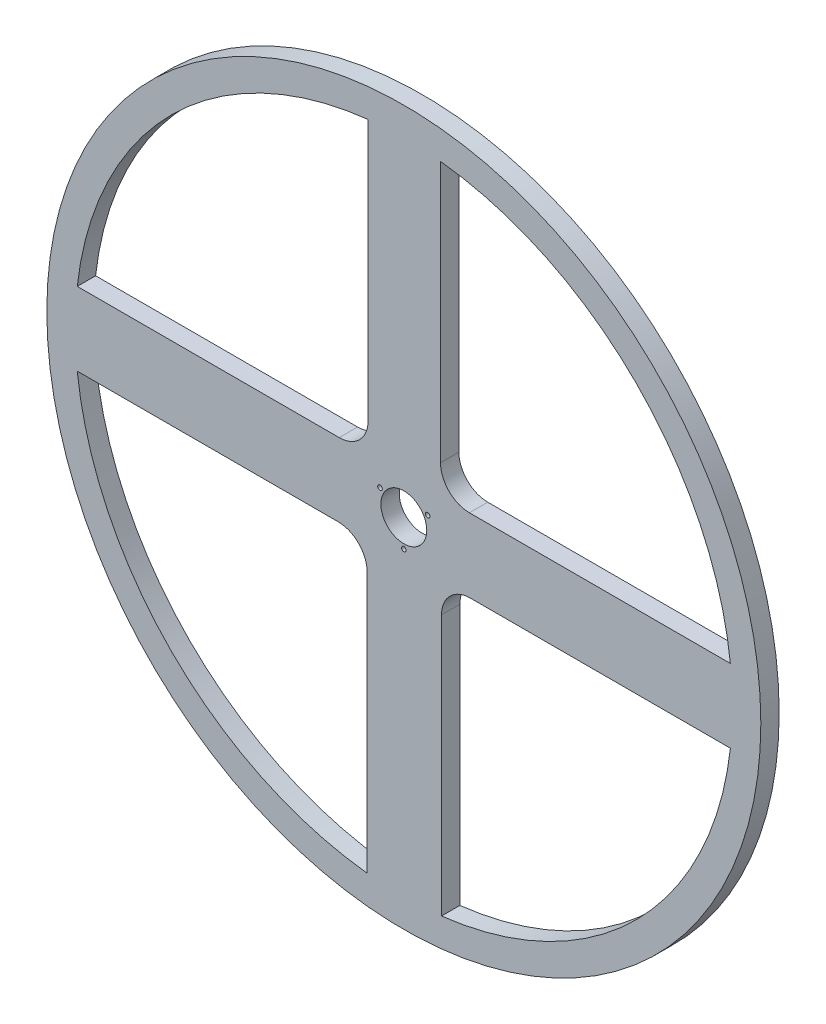
ISO-10303-21;
HEADER;
FILE_DESCRIPTION(('STEP AP214'),'2;1');
FILE_NAME('part.step','',(''),(''),'','','');
FILE_SCHEMA(('AUTOMOTIVE_DESIGN { 1 0 10303 214 1 1 1 1 }'));
ENDSEC;
DATA;
#1=APPLICATION_CONTEXT('core data for automotive mechanical design processes');
#2=APPLICATION_PROTOCOL_DEFINITION('international standard','automotive_design',2000,#1);
#3=PRODUCT_CONTEXT('',#1,'mechanical');
#4=PRODUCT('Part','Part','',(#3));
#5=PRODUCT_RELATED_PRODUCT_CATEGORY('part','',(#4));
#6=PRODUCT_DEFINITION_FORMATION('','',#4);
#7=PRODUCT_DEFINITION_CONTEXT('part definition',#1,'design');
#8=PRODUCT_DEFINITION('design','',#6,#7);
#9=PRODUCT_DEFINITION_SHAPE('','',#8);
#10=(LENGTH_UNIT() NAMED_UNIT(*) SI_UNIT(.MILLI.,.METRE.));
#11=(NAMED_UNIT(*) PLANE_ANGLE_UNIT() SI_UNIT($,.RADIAN.));
#12=(NAMED_UNIT(*) SI_UNIT($,.STERADIAN.) SOLID_ANGLE_UNIT());
#13=UNCERTAINTY_MEASURE_WITH_UNIT(LENGTH_MEASURE(1.E-05),#10,'distance_accuracy_value','');
#14=(GEOMETRIC_REPRESENTATION_CONTEXT(3) GLOBAL_UNCERTAINTY_ASSIGNED_CONTEXT((#13)) GLOBAL_UNIT_ASSIGNED_CONTEXT((#10,
#11,#12)) REPRESENTATION_CONTEXT('',''));
#15=CARTESIAN_POINT('',(0.,0.,0.));
#16=DIRECTION('',(0.,0.,1.));
#17=DIRECTION('',(1.,0.,0.));
#18=AXIS2_PLACEMENT_3D('',#15,#16,#17);
#19=CARTESIAN_POINT('',(0.,-12.7,6.35));
#20=DIRECTION('',(0.,1.,0.));
#21=DIRECTION('',(-1.,0.,0.));
#22=AXIS2_PLACEMENT_3D('',#19,#20,#21);
#23=PLANE('',#22);
#24=DIRECTION('',(1.,0.,0.));
#25=VECTOR('',#24,1.);
#26=CARTESIAN_POINT('',(0.,-12.7,0.));
#27=LINE('',#26,#25);
#28=CARTESIAN_POINT('',(23.0444472963723,-12.7,0.));
#29=VERTEX_POINT('',#28);
#30=CARTESIAN_POINT('',(112.9985579554,-12.7,0.));
#31=VERTEX_POINT('',#30);
#32=EDGE_CURVE('E224',#29,#31,#27,.T.);
#33=ORIENTED_EDGE('',*,*,#32,.T.);
#34=DIRECTION('',(0.,0.,-1.));
#35=VECTOR('',#34,1.);
#36=CARTESIAN_POINT('',(112.9985579554,-12.7,6.35));
#37=LINE('',#36,#35);
#38=CARTESIAN_POINT('',(112.9985579554,-12.7,6.35));
#39=VERTEX_POINT('',#38);
#40=EDGE_CURVE('E11',#39,#31,#37,.T.);
#41=ORIENTED_EDGE('',*,*,#40,.F.);
#42=DIRECTION('',(1.,0.,0.));
#43=VECTOR('',#42,1.);
#44=CARTESIAN_POINT('',(0.,-12.7,6.35));
#45=LINE('',#44,#43);
#46=CARTESIAN_POINT('',(23.0444472963723,-12.7,6.35));
#47=VERTEX_POINT('',#46);
#48=EDGE_CURVE('E177',#47,#39,#45,.T.);
#49=ORIENTED_EDGE('',*,*,#48,.F.);
#50=DIRECTION('',(0.,0.,-1.));
#51=VECTOR('',#50,1.);
#52=CARTESIAN_POINT('',(23.0444472963723,-12.7,6.35));
#53=LINE('',#52,#51);
#54=EDGE_CURVE('E233',#47,#29,#53,.T.);
#55=ORIENTED_EDGE('',*,*,#54,.T.);
#56=EDGE_LOOP('',(#33,#41,#49,#55));
#57=FACE_BOUND('',#56,.T.);
#58=ADVANCED_FACE('F43',(#57),#23,.F.);
#59=CARTESIAN_POINT('',(0.,0.,6.35));
#60=DIRECTION('',(0.,0.,-1.));
#61=DIRECTION('',(-1.,0.,0.));
#62=AXIS2_PLACEMENT_3D('',#59,#60,#61);
#63=CYLINDRICAL_SURFACE('',#62,113.71);
#64=CARTESIAN_POINT('',(0.,0.,0.));
#65=DIRECTION('',(0.,0.,1.));
#66=DIRECTION('',(1.,0.,0.));
#67=AXIS2_PLACEMENT_3D('',#64,#65,#66);
#68=CIRCLE('',#67,113.71);
#69=CARTESIAN_POINT('',(13.0444472963723,-112.959313448392,0.));
#70=VERTEX_POINT('',#69);
#71=EDGE_CURVE('E167',#70,#31,#68,.T.);
#72=ORIENTED_EDGE('',*,*,#71,.F.);
#73=DIRECTION('',(0.,0.,-1.));
#74=VECTOR('',#73,1.);
#75=CARTESIAN_POINT('',(13.0444472963723,-112.959313448392,6.35));
#76=LINE('',#75,#74);
#77=CARTESIAN_POINT('',(13.0444472963723,-112.959313448392,6.35));
#78=VERTEX_POINT('',#77);
#79=EDGE_CURVE('E53',#78,#70,#76,.T.);
#80=ORIENTED_EDGE('',*,*,#79,.F.);
#81=CARTESIAN_POINT('',(0.,0.,6.35));
#82=DIRECTION('',(0.,0.,1.));
#83=DIRECTION('',(1.,0.,0.));
#84=AXIS2_PLACEMENT_3D('',#81,#82,#83);
#85=CIRCLE('',#84,113.71);
#86=EDGE_CURVE('E165',#78,#39,#85,.T.);
#87=ORIENTED_EDGE('',*,*,#86,.T.);
#88=ORIENTED_EDGE('',*,*,#40,.T.);
#89=EDGE_LOOP('',(#72,#80,#87,#88));
#90=FACE_BOUND('',#89,.T.);
#91=ADVANCED_FACE('F164',(#90),#63,.F.);
#92=CARTESIAN_POINT('',(13.0444472963723,0.,6.35));
#93=DIRECTION('',(1.,0.,0.));
#94=DIRECTION('',(0.,1.,0.));
#95=AXIS2_PLACEMENT_3D('',#92,#93,#94);
#96=PLANE('',#95);
#97=DIRECTION('',(0.,-1.,0.));
#98=VECTOR('',#97,1.);
#99=CARTESIAN_POINT('',(13.0444472963723,0.,0.));
#100=LINE('',#99,#98);
#101=CARTESIAN_POINT('',(13.0444472963723,-22.7,0.));
#102=VERTEX_POINT('',#101);
#103=EDGE_CURVE('E227',#102,#70,#100,.T.);
#104=ORIENTED_EDGE('',*,*,#103,.F.);
#105=DIRECTION('',(0.,0.,-1.));
#106=VECTOR('',#105,1.);
#107=CARTESIAN_POINT('',(13.0444472963723,-22.7,6.35));
#108=LINE('',#107,#106);
#109=CARTESIAN_POINT('',(13.0444472963723,-22.7,6.35));
#110=VERTEX_POINT('',#109);
#111=EDGE_CURVE('E113',#110,#102,#108,.T.);
#112=ORIENTED_EDGE('',*,*,#111,.F.);
#113=DIRECTION('',(0.,-1.,0.));
#114=VECTOR('',#113,1.);
#115=CARTESIAN_POINT('',(13.0444472963723,0.,6.35));
#116=LINE('',#115,#114);
#117=EDGE_CURVE('E175',#110,#78,#116,.T.);
#118=ORIENTED_EDGE('',*,*,#117,.T.);
#119=ORIENTED_EDGE('',*,*,#79,.T.);
#120=EDGE_LOOP('',(#104,#112,#118,#119));
#121=FACE_BOUND('',#120,.T.);
#122=ADVANCED_FACE('F182',(#121),#96,.T.);
#123=CARTESIAN_POINT('',(-112.9985579554,-12.7,0.));
#124=VERTEX_POINT('',#123);
#125=CARTESIAN_POINT('',(-12.7,-112.9985579554,0.));
#126=VERTEX_POINT('',#125);
#127=EDGE_CURVE('E214',#124,#126,#68,.T.);
#128=ORIENTED_EDGE('',*,*,#127,.F.);
#129=DIRECTION('',(0.,0.,-1.));
#130=VECTOR('',#129,1.);
#131=CARTESIAN_POINT('',(-112.9985579554,-12.7,6.35));
#132=LINE('',#131,#130);
#133=CARTESIAN_POINT('',(-112.9985579554,-12.7,6.35));
#134=VERTEX_POINT('',#133);
#135=EDGE_CURVE('E235',#134,#124,#132,.T.);
#136=ORIENTED_EDGE('',*,*,#135,.F.);
#137=CARTESIAN_POINT('',(-12.7,-112.9985579554,6.35));
#138=VERTEX_POINT('',#137);
#139=EDGE_CURVE('E180',#134,#138,#85,.T.);
#140=ORIENTED_EDGE('',*,*,#139,.T.);
#141=DIRECTION('',(0.,0.,-1.));
#142=VECTOR('',#141,1.);
#143=CARTESIAN_POINT('',(-12.7,-112.9985579554,6.35));
#144=LINE('',#143,#142);
#145=EDGE_CURVE('E237',#138,#126,#144,.T.);
#146=ORIENTED_EDGE('',*,*,#145,.T.);
#147=EDGE_LOOP('',(#128,#136,#140,#146));
#148=FACE_BOUND('',#147,.T.);
#149=ADVANCED_FACE('F309',(#148),#63,.F.);
#150=CARTESIAN_POINT('',(0.,-12.7,6.35));
#151=DIRECTION('',(0.,1.,0.));
#152=DIRECTION('',(0.,0.,1.));
#153=AXIS2_PLACEMENT_3D('',#150,#151,#152);
#154=PLANE('',#153);
#155=DIRECTION('',(1.,0.,0.));
#156=VECTOR('',#155,1.);
#157=CARTESIAN_POINT('',(0.,-12.7,0.));
#158=LINE('',#157,#156);
#159=CARTESIAN_POINT('',(-22.7000000000001,-12.7,0.));
#160=VERTEX_POINT('',#159);
#161=EDGE_CURVE('E215',#124,#160,#158,.T.);
#162=ORIENTED_EDGE('',*,*,#161,.T.);
#163=DIRECTION('',(0.,0.,-1.));
#164=VECTOR('',#163,1.);
#165=CARTESIAN_POINT('',(-22.7000000000001,-12.7,6.35));
#166=LINE('',#165,#164);
#167=CARTESIAN_POINT('',(-22.7000000000001,-12.7,6.35));
#168=VERTEX_POINT('',#167);
#169=EDGE_CURVE('E242',#168,#160,#166,.T.);
#170=ORIENTED_EDGE('',*,*,#169,.F.);
#171=DIRECTION('',(1.,0.,0.));
#172=VECTOR('',#171,1.);
#173=CARTESIAN_POINT('',(0.,-12.7,6.35));
#174=LINE('',#173,#172);
#175=EDGE_CURVE('E292',#134,#168,#174,.T.);
#176=ORIENTED_EDGE('',*,*,#175,.F.);
#177=ORIENTED_EDGE('',*,*,#135,.T.);
#178=EDGE_LOOP('',(#162,#170,#176,#177));
#179=FACE_BOUND('',#178,.T.);
#180=ADVANCED_FACE('F393',(#179),#154,.F.);
#181=CARTESIAN_POINT('',(-22.7,-22.7,6.35));
#182=DIRECTION('',(0.,0.,-1.));
#183=DIRECTION('',(-1.,0.,0.));
#184=AXIS2_PLACEMENT_3D('',#181,#182,#183);
#185=CYLINDRICAL_SURFACE('',#184,10.);
#186=CARTESIAN_POINT('',(-22.7,-22.7,0.));
#187=DIRECTION('',(0.,0.,1.));
#188=DIRECTION('',(1.,0.,0.));
#189=AXIS2_PLACEMENT_3D('',#186,#187,#188);
#190=CIRCLE('',#189,10.);
#191=CARTESIAN_POINT('',(-12.7,-22.7000000000001,0.));
#192=VERTEX_POINT('',#191);
#193=EDGE_CURVE('E218',#192,#160,#190,.T.);
#194=ORIENTED_EDGE('',*,*,#193,.F.);
#195=DIRECTION('',(0.,0.,-1.));
#196=VECTOR('',#195,1.);
#197=CARTESIAN_POINT('',(-12.7,-22.7000000000001,6.35));
#198=LINE('',#197,#196);
#199=CARTESIAN_POINT('',(-12.7,-22.7000000000001,6.35));
#200=VERTEX_POINT('',#199);
#201=EDGE_CURVE('E239',#200,#192,#198,.T.);
#202=ORIENTED_EDGE('',*,*,#201,.F.);
#203=CARTESIAN_POINT('',(-22.7,-22.7,6.35));
#204=DIRECTION('',(0.,0.,1.));
#205=DIRECTION('',(1.,0.,0.));
#206=AXIS2_PLACEMENT_3D('',#203,#204,#205);
#207=CIRCLE('',#206,10.);
#208=EDGE_CURVE('E294',#200,#168,#207,.T.);
#209=ORIENTED_EDGE('',*,*,#208,.T.);
#210=ORIENTED_EDGE('',*,*,#169,.T.);
#211=EDGE_LOOP('',(#194,#202,#209,#210));
#212=FACE_BOUND('',#211,.T.);
#213=ADVANCED_FACE('F390',(#212),#185,.F.);
#214=CARTESIAN_POINT('',(-12.3555527036276,113.03673923724,0.));
#215=VERTEX_POINT('',#214);
#216=CARTESIAN_POINT('',(-112.9985579554,12.7,0.));
#217=VERTEX_POINT('',#216);
#218=EDGE_CURVE('E197',#215,#217,#68,.T.);
#219=ORIENTED_EDGE('',*,*,#218,.F.);
#220=DIRECTION('',(0.,0.,-1.));
#221=VECTOR('',#220,1.);
#222=CARTESIAN_POINT('',(-12.3555527036276,113.03673923724,6.35));
#223=LINE('',#222,#221);
#224=CARTESIAN_POINT('',(-12.3555527036276,113.03673923724,6.35));
#225=VERTEX_POINT('',#224);
#226=EDGE_CURVE('E240',#225,#215,#223,.T.);
#227=ORIENTED_EDGE('',*,*,#226,.F.);
#228=CARTESIAN_POINT('',(-112.9985579554,12.7,6.35));
#229=VERTEX_POINT('',#228);
#230=EDGE_CURVE('E277',#225,#229,#85,.T.);
#231=ORIENTED_EDGE('',*,*,#230,.T.);
#232=DIRECTION('',(0.,0.,-1.));
#233=VECTOR('',#232,1.);
#234=CARTESIAN_POINT('',(-112.9985579554,12.7,6.35));
#235=LINE('',#234,#233);
#236=EDGE_CURVE('E245',#229,#217,#235,.T.);
#237=ORIENTED_EDGE('',*,*,#236,.T.);
#238=EDGE_LOOP('',(#219,#227,#231,#237));
#239=FACE_BOUND('',#238,.T.);
#240=ADVANCED_FACE('F366',(#239),#63,.F.);
#241=CARTESIAN_POINT('',(-12.3555527036276,0.,6.35));
#242=DIRECTION('',(-1.,0.,0.));
#243=DIRECTION('',(0.,-1.,0.));
#244=AXIS2_PLACEMENT_3D('',#241,#242,#243);
#245=PLANE('',#244);
#246=DIRECTION('',(0.,1.,0.));
#247=VECTOR('',#246,1.);
#248=CARTESIAN_POINT('',(-12.3555527036276,0.,0.));
#249=LINE('',#248,#247);
#250=CARTESIAN_POINT('',(-12.3555527036276,22.7,0.));
#251=VERTEX_POINT('',#250);
#252=EDGE_CURVE('E205',#251,#215,#249,.T.);
#253=ORIENTED_EDGE('',*,*,#252,.F.);
#254=DIRECTION('',(0.,0.,-1.));
#255=VECTOR('',#254,1.);
#256=CARTESIAN_POINT('',(-12.3555527036276,22.7,6.35));
#257=LINE('',#256,#255);
#258=CARTESIAN_POINT('',(-12.3555527036276,22.7,6.35));
#259=VERTEX_POINT('',#258);
#260=EDGE_CURVE('E249',#259,#251,#257,.T.);
#261=ORIENTED_EDGE('',*,*,#260,.F.);
#262=DIRECTION('',(0.,1.,0.));
#263=VECTOR('',#262,1.);
#264=CARTESIAN_POINT('',(-12.3555527036276,0.,6.35));
#265=LINE('',#264,#263);
#266=EDGE_CURVE('E281',#259,#225,#265,.T.);
#267=ORIENTED_EDGE('',*,*,#266,.T.);
#268=ORIENTED_EDGE('',*,*,#226,.T.);
#269=EDGE_LOOP('',(#253,#261,#267,#268));
#270=FACE_BOUND('',#269,.T.);
#271=ADVANCED_FACE('F355',(#270),#245,.T.);
#272=CARTESIAN_POINT('',(-22.3555527036277,22.7,6.35));
#273=DIRECTION('',(0.,0.,-1.));
#274=DIRECTION('',(-1.,0.,0.));
#275=AXIS2_PLACEMENT_3D('',#272,#273,#274);
#276=CYLINDRICAL_SURFACE('',#275,10.);
#277=CARTESIAN_POINT('',(-22.3555527036277,22.7,0.));
#278=DIRECTION('',(0.,0.,1.));
#279=DIRECTION('',(1.,0.,0.));
#280=AXIS2_PLACEMENT_3D('',#277,#278,#279);
#281=CIRCLE('',#280,10.);
#282=CARTESIAN_POINT('',(-22.3555527036277,12.7,0.));
#283=VERTEX_POINT('',#282);
#284=EDGE_CURVE('E208',#251,#283,#281,.F.);
#285=ORIENTED_EDGE('',*,*,#284,.T.);
#286=DIRECTION('',(0.,0.,-1.));
#287=VECTOR('',#286,1.);
#288=CARTESIAN_POINT('',(-22.3555527036277,12.7,6.35));
#289=LINE('',#288,#287);
#290=CARTESIAN_POINT('',(-22.3555527036277,12.7,6.35));
#291=VERTEX_POINT('',#290);
#292=EDGE_CURVE('E247',#291,#283,#289,.T.);
#293=ORIENTED_EDGE('',*,*,#292,.F.);
#294=CARTESIAN_POINT('',(-22.3555527036277,22.7,6.35));
#295=DIRECTION('',(0.,0.,1.));
#296=DIRECTION('',(1.,0.,0.));
#297=AXIS2_PLACEMENT_3D('',#294,#295,#296);
#298=CIRCLE('',#297,10.);
#299=EDGE_CURVE('E287',#259,#291,#298,.F.);
#300=ORIENTED_EDGE('',*,*,#299,.F.);
#301=ORIENTED_EDGE('',*,*,#260,.T.);
#302=EDGE_LOOP('',(#285,#293,#300,#301));
#303=FACE_BOUND('',#302,.T.);
#304=ADVANCED_FACE('F361',(#303),#276,.F.);
#305=CARTESIAN_POINT('',(112.9985579554,12.7,0.));
#306=VERTEX_POINT('',#305);
#307=CARTESIAN_POINT('',(12.7,112.9985579554,0.));
#308=VERTEX_POINT('',#307);
#309=EDGE_CURVE('E192',#306,#308,#68,.T.);
#310=ORIENTED_EDGE('',*,*,#309,.F.);
#311=DIRECTION('',(0.,0.,-1.));
#312=VECTOR('',#311,1.);
#313=CARTESIAN_POINT('',(112.9985579554,12.7,6.35));
#314=LINE('',#313,#312);
#315=CARTESIAN_POINT('',(112.9985579554,12.7,6.35));
#316=VERTEX_POINT('',#315);
#317=EDGE_CURVE('E47',#316,#306,#314,.T.);
#318=ORIENTED_EDGE('',*,*,#317,.F.);
#319=CARTESIAN_POINT('',(12.7,112.9985579554,6.35));
#320=VERTEX_POINT('',#319);
#321=EDGE_CURVE('E181',#316,#320,#85,.T.);
#322=ORIENTED_EDGE('',*,*,#321,.T.);
#323=DIRECTION('',(0.,0.,-1.));
#324=VECTOR('',#323,1.);
#325=CARTESIAN_POINT('',(12.7,112.9985579554,6.35));
#326=LINE('',#325,#324);
#327=EDGE_CURVE('E191',#320,#308,#326,.T.);
#328=ORIENTED_EDGE('',*,*,#327,.T.);
#329=EDGE_LOOP('',(#310,#318,#322,#328));
#330=FACE_BOUND('',#329,.T.);
#331=ADVANCED_FACE('F264',(#330),#63,.F.);
#332=CARTESIAN_POINT('',(0.,12.7,6.35));
#333=DIRECTION('',(0.,1.,0.));
#334=DIRECTION('',(-1.,0.,0.));
#335=AXIS2_PLACEMENT_3D('',#332,#333,#334);
#336=PLANE('',#335);
#337=DIRECTION('',(1.,0.,0.));
#338=VECTOR('',#337,1.);
#339=CARTESIAN_POINT('',(0.,12.7,0.));
#340=LINE('',#339,#338);
#341=CARTESIAN_POINT('',(22.7000000000001,12.7,0.));
#342=VERTEX_POINT('',#341);
#343=EDGE_CURVE('E195',#342,#306,#340,.T.);
#344=ORIENTED_EDGE('',*,*,#343,.F.);
#345=DIRECTION('',(0.,0.,-1.));
#346=VECTOR('',#345,1.);
#347=CARTESIAN_POINT('',(22.7000000000001,12.7,6.35));
#348=LINE('',#347,#346);
#349=CARTESIAN_POINT('',(22.7000000000001,12.7,6.35));
#350=VERTEX_POINT('',#349);
#351=EDGE_CURVE('E255',#350,#342,#348,.T.);
#352=ORIENTED_EDGE('',*,*,#351,.F.);
#353=DIRECTION('',(1.,0.,0.));
#354=VECTOR('',#353,1.);
#355=CARTESIAN_POINT('',(0.,12.7,6.35));
#356=LINE('',#355,#354);
#357=EDGE_CURVE('E263',#350,#316,#356,.T.);
#358=ORIENTED_EDGE('',*,*,#357,.T.);
#359=ORIENTED_EDGE('',*,*,#317,.T.);
#360=EDGE_LOOP('',(#344,#352,#358,#359));
#361=FACE_BOUND('',#360,.T.);
#362=ADVANCED_FACE('F45',(#361),#336,.T.);
#363=CARTESIAN_POINT('',(22.7,22.7,6.35));
#364=DIRECTION('',(0.,0.,-1.));
#365=DIRECTION('',(-1.,0.,0.));
#366=AXIS2_PLACEMENT_3D('',#363,#364,#365);
#367=CYLINDRICAL_SURFACE('',#366,10.);
#368=CARTESIAN_POINT('',(22.7,22.7,0.));
#369=DIRECTION('',(0.,0.,1.));
#370=DIRECTION('',(1.,0.,0.));
#371=AXIS2_PLACEMENT_3D('',#368,#369,#370);
#372=CIRCLE('',#371,10.);
#373=CARTESIAN_POINT('',(12.7,22.7000000000001,0.));
#374=VERTEX_POINT('',#373);
#375=EDGE_CURVE('E200',#342,#374,#372,.F.);
#376=ORIENTED_EDGE('',*,*,#375,.T.);
#377=DIRECTION('',(0.,0.,-1.));
#378=VECTOR('',#377,1.);
#379=CARTESIAN_POINT('',(12.7,22.7000000000001,6.35));
#380=LINE('',#379,#378);
#381=CARTESIAN_POINT('',(12.7,22.7000000000001,6.35));
#382=VERTEX_POINT('',#381);
#383=EDGE_CURVE('E253',#382,#374,#380,.T.);
#384=ORIENTED_EDGE('',*,*,#383,.F.);
#385=CARTESIAN_POINT('',(22.7,22.7,6.35));
#386=DIRECTION('',(0.,0.,1.));
#387=DIRECTION('',(1.,0.,0.));
#388=AXIS2_PLACEMENT_3D('',#385,#386,#387);
#389=CIRCLE('',#388,10.);
#390=EDGE_CURVE('E278',#350,#382,#389,.F.);
#391=ORIENTED_EDGE('',*,*,#390,.F.);
#392=ORIENTED_EDGE('',*,*,#351,.T.);
#393=EDGE_LOOP('',(#376,#384,#391,#392));
#394=FACE_BOUND('',#393,.T.);
#395=ADVANCED_FACE('F271',(#394),#367,.F.);
#396=CARTESIAN_POINT('',(23.0444472963723,-22.7,6.35));
#397=DIRECTION('',(0.,0.,-1.));
#398=DIRECTION('',(-1.,0.,0.));
#399=AXIS2_PLACEMENT_3D('',#396,#397,#398);
#400=CYLINDRICAL_SURFACE('',#399,10.);
#401=CARTESIAN_POINT('',(23.0444472963723,-22.7,0.));
#402=DIRECTION('',(0.,0.,1.));
#403=DIRECTION('',(1.,0.,0.));
#404=AXIS2_PLACEMENT_3D('',#401,#402,#403);
#405=CIRCLE('',#404,10.);
#406=EDGE_CURVE('E116',#102,#29,#405,.F.);
#407=ORIENTED_EDGE('',*,*,#406,.T.);
#408=ORIENTED_EDGE('',*,*,#54,.F.);
#409=CARTESIAN_POINT('',(23.0444472963723,-22.7,6.35));
#410=DIRECTION('',(0.,0.,1.));
#411=DIRECTION('',(1.,0.,0.));
#412=AXIS2_PLACEMENT_3D('',#409,#410,#411);
#413=CIRCLE('',#412,10.);
#414=EDGE_CURVE('E62',#110,#47,#413,.F.);
#415=ORIENTED_EDGE('',*,*,#414,.F.);
#416=ORIENTED_EDGE('',*,*,#111,.T.);
#417=EDGE_LOOP('',(#407,#408,#415,#416));
#418=FACE_BOUND('',#417,.T.);
#419=ADVANCED_FACE('F373',(#418),#400,.F.);
#420=CARTESIAN_POINT('',(-12.7,0.,6.35));
#421=DIRECTION('',(1.,0.,0.));
#422=DIRECTION('',(0.,1.,0.));
#423=AXIS2_PLACEMENT_3D('',#420,#421,#422);
#424=PLANE('',#423);
#425=DIRECTION('',(0.,-1.,0.));
#426=VECTOR('',#425,1.);
#427=CARTESIAN_POINT('',(-12.7,0.,0.));
#428=LINE('',#427,#426);
#429=EDGE_CURVE('E221',#192,#126,#428,.T.);
#430=ORIENTED_EDGE('',*,*,#429,.T.);
#431=ORIENTED_EDGE('',*,*,#145,.F.);
#432=DIRECTION('',(0.,-1.,0.));
#433=VECTOR('',#432,1.);
#434=CARTESIAN_POINT('',(-12.7,0.,6.35));
#435=LINE('',#434,#433);
#436=EDGE_CURVE('E296',#200,#138,#435,.T.);
#437=ORIENTED_EDGE('',*,*,#436,.F.);
#438=ORIENTED_EDGE('',*,*,#201,.T.);
#439=EDGE_LOOP('',(#430,#431,#437,#438));
#440=FACE_BOUND('',#439,.T.);
#441=ADVANCED_FACE('F304',(#440),#424,.F.);
#442=CARTESIAN_POINT('',(0.,12.7,6.35));
#443=DIRECTION('',(0.,1.,0.));
#444=DIRECTION('',(-1.,0.,0.));
#445=AXIS2_PLACEMENT_3D('',#442,#443,#444);
#446=PLANE('',#445);
#447=DIRECTION('',(1.,0.,0.));
#448=VECTOR('',#447,1.);
#449=CARTESIAN_POINT('',(0.,12.7,0.));
#450=LINE('',#449,#448);
#451=EDGE_CURVE('E211',#217,#283,#450,.T.);
#452=ORIENTED_EDGE('',*,*,#451,.F.);
#453=ORIENTED_EDGE('',*,*,#236,.F.);
#454=DIRECTION('',(1.,0.,0.));
#455=VECTOR('',#454,1.);
#456=CARTESIAN_POINT('',(0.,12.7,6.35));
#457=LINE('',#456,#455);
#458=EDGE_CURVE('E289',#229,#291,#457,.T.);
#459=ORIENTED_EDGE('',*,*,#458,.T.);
#460=ORIENTED_EDGE('',*,*,#292,.T.);
#461=EDGE_LOOP('',(#452,#453,#459,#460));
#462=FACE_BOUND('',#461,.T.);
#463=ADVANCED_FACE('F364',(#462),#446,.T.);
#464=CARTESIAN_POINT('',(12.7,0.,6.35));
#465=DIRECTION('',(-1.,0.,0.));
#466=DIRECTION('',(0.,0.,1.));
#467=AXIS2_PLACEMENT_3D('',#464,#465,#466);
#468=PLANE('',#467);
#469=DIRECTION('',(0.,1.,0.));
#470=VECTOR('',#469,1.);
#471=CARTESIAN_POINT('',(12.7,0.,0.));
#472=LINE('',#471,#470);
#473=EDGE_CURVE('E202',#374,#308,#472,.T.);
#474=ORIENTED_EDGE('',*,*,#473,.T.);
#475=ORIENTED_EDGE('',*,*,#327,.F.);
#476=DIRECTION('',(0.,1.,0.));
#477=VECTOR('',#476,1.);
#478=CARTESIAN_POINT('',(12.7,0.,6.35));
#479=LINE('',#478,#477);
#480=EDGE_CURVE('E275',#382,#320,#479,.T.);
#481=ORIENTED_EDGE('',*,*,#480,.F.);
#482=ORIENTED_EDGE('',*,*,#383,.T.);
#483=EDGE_LOOP('',(#474,#475,#481,#482));
#484=FACE_BOUND('',#483,.T.);
#485=ADVANCED_FACE('F274',(#484),#468,.F.);
#486=CARTESIAN_POINT('',(0.,0.,6.35));
#487=DIRECTION('',(0.,0.,-1.));
#488=DIRECTION('',(-1.,0.,0.));
#489=AXIS2_PLACEMENT_3D('',#486,#487,#488);
#490=CYLINDRICAL_SURFACE('',#489,123.5325);
#491=CARTESIAN_POINT('',(0.,0.,6.35));
#492=DIRECTION('',(0.,0.,1.));
#493=DIRECTION('',(1.,0.,0.));
#494=AXIS2_PLACEMENT_3D('',#491,#492,#493);
#495=CIRCLE('',#494,123.5325);
#496=CARTESIAN_POINT('',(123.5325,0.,6.35));
#497=VERTEX_POINT('',#496);
#498=EDGE_CURVE('E184',#497,#497,#495,.T.);
#499=ORIENTED_EDGE('',*,*,#498,.F.);
#500=EDGE_LOOP('',(#499));
#501=FACE_BOUND('',#500,.T.);
#502=CARTESIAN_POINT('',(0.,0.,0.));
#503=DIRECTION('',(0.,0.,1.));
#504=DIRECTION('',(1.,0.,0.));
#505=AXIS2_PLACEMENT_3D('',#502,#503,#504);
#506=CIRCLE('',#505,123.5325);
#507=CARTESIAN_POINT('',(123.5325,0.,0.));
#508=VERTEX_POINT('',#507);
#509=EDGE_CURVE('E230',#508,#508,#506,.T.);
#510=ORIENTED_EDGE('',*,*,#509,.T.);
#511=EDGE_LOOP('',(#510));
#512=FACE_BOUND('',#511,.T.);
#513=ADVANCED_FACE('F341',(#501,#512),#490,.T.);
#514=CARTESIAN_POINT('',(0.,0.,6.35));
#515=DIRECTION('',(0.,0.,1.));
#516=DIRECTION('',(1.,0.,0.));
#517=AXIS2_PLACEMENT_3D('',#514,#515,#516);
#518=PLANE('',#517);
#519=CARTESIAN_POINT('',(-8.24889197104676,4.76250000000004,6.35));
#520=DIRECTION('',(0.,0.,1.));
#521=DIRECTION('',(1.,0.,0.));
#522=AXIS2_PLACEMENT_3D('',#519,#520,#521);
#523=CIRCLE('',#522,0.79375);
#524=CARTESIAN_POINT('',(-7.45514197104676,4.76250000000004,6.35));
#525=VERTEX_POINT('',#524);
#526=EDGE_CURVE('E328',#525,#525,#523,.T.);
#527=ORIENTED_EDGE('',*,*,#526,.F.);
#528=EDGE_LOOP('',(#527));
#529=FACE_BOUND('',#528,.T.);
#530=CARTESIAN_POINT('',(8.24889197104675,4.76250000000004,6.35));
#531=DIRECTION('',(0.,0.,1.));
#532=DIRECTION('',(1.,0.,0.));
#533=AXIS2_PLACEMENT_3D('',#530,#531,#532);
#534=CIRCLE('',#533,0.793750000000001);
#535=CARTESIAN_POINT('',(9.04264197104676,4.76250000000004,6.35));
#536=VERTEX_POINT('',#535);
#537=EDGE_CURVE('E321',#536,#536,#534,.T.);
#538=ORIENTED_EDGE('',*,*,#537,.F.);
#539=EDGE_LOOP('',(#538));
#540=FACE_BOUND('',#539,.T.);
#541=CARTESIAN_POINT('',(0.,-9.525,6.35));
#542=DIRECTION('',(0.,0.,1.));
#543=DIRECTION('',(1.,0.,0.));
#544=AXIS2_PLACEMENT_3D('',#541,#542,#543);
#545=CIRCLE('',#544,0.79375);
#546=CARTESIAN_POINT('',(0.79375,-9.525,6.35));
#547=VERTEX_POINT('',#546);
#548=EDGE_CURVE('E322',#547,#547,#545,.T.);
#549=ORIENTED_EDGE('',*,*,#548,.F.);
#550=EDGE_LOOP('',(#549));
#551=FACE_BOUND('',#550,.T.);
#552=CARTESIAN_POINT('',(0.,0.,6.35));
#553=DIRECTION('',(0.,0.,1.));
#554=DIRECTION('',(1.,0.,0.));
#555=AXIS2_PLACEMENT_3D('',#552,#553,#554);
#556=CIRCLE('',#555,7.937515);
#557=CARTESIAN_POINT('',(7.937515,0.,6.35));
#558=VERTEX_POINT('',#557);
#559=EDGE_CURVE('E314',#558,#558,#556,.T.);
#560=ORIENTED_EDGE('',*,*,#559,.F.);
#561=EDGE_LOOP('',(#560));
#562=FACE_BOUND('',#561,.T.);
#563=ORIENTED_EDGE('',*,*,#321,.F.);
#564=ORIENTED_EDGE('',*,*,#357,.F.);
#565=ORIENTED_EDGE('',*,*,#390,.T.);
#566=ORIENTED_EDGE('',*,*,#480,.T.);
#567=EDGE_LOOP('',(#563,#564,#565,#566));
#568=FACE_BOUND('',#567,.T.);
#569=ORIENTED_EDGE('',*,*,#230,.F.);
#570=ORIENTED_EDGE('',*,*,#266,.F.);
#571=ORIENTED_EDGE('',*,*,#299,.T.);
#572=ORIENTED_EDGE('',*,*,#458,.F.);
#573=EDGE_LOOP('',(#569,#570,#571,#572));
#574=FACE_BOUND('',#573,.T.);
#575=ORIENTED_EDGE('',*,*,#139,.F.);
#576=ORIENTED_EDGE('',*,*,#175,.T.);
#577=ORIENTED_EDGE('',*,*,#208,.F.);
#578=ORIENTED_EDGE('',*,*,#436,.T.);
#579=EDGE_LOOP('',(#575,#576,#577,#578));
#580=FACE_BOUND('',#579,.T.);
#581=ORIENTED_EDGE('',*,*,#48,.T.);
#582=ORIENTED_EDGE('',*,*,#86,.F.);
#583=ORIENTED_EDGE('',*,*,#117,.F.);
#584=ORIENTED_EDGE('',*,*,#414,.T.);
#585=EDGE_LOOP('',(#581,#582,#583,#584));
#586=FACE_BOUND('',#585,.T.);
#587=ORIENTED_EDGE('',*,*,#498,.T.);
#588=EDGE_LOOP('',(#587));
#589=FACE_BOUND('',#588,.T.);
#590=ADVANCED_FACE('F173',(#529,#540,#551,#562,#568,#574,#580,#586,#589),#518,.T.);
#591=CARTESIAN_POINT('',(0.,0.,0.));
#592=DIRECTION('',(0.,0.,1.));
#593=DIRECTION('',(1.,0.,0.));
#594=AXIS2_PLACEMENT_3D('',#591,#592,#593);
#595=PLANE('',#594);
#596=CARTESIAN_POINT('',(-8.24889197104676,4.76250000000004,0.));
#597=DIRECTION('',(0.,0.,1.));
#598=DIRECTION('',(1.,0.,0.));
#599=AXIS2_PLACEMENT_3D('',#596,#597,#598);
#600=CIRCLE('',#599,0.79375);
#601=CARTESIAN_POINT('',(-7.45514197104676,4.76250000000004,0.));
#602=VERTEX_POINT('',#601);
#603=EDGE_CURVE('E317',#602,#602,#600,.F.);
#604=ORIENTED_EDGE('',*,*,#603,.F.);
#605=EDGE_LOOP('',(#604));
#606=FACE_BOUND('',#605,.T.);
#607=CARTESIAN_POINT('',(8.24889197104675,4.76250000000004,0.));
#608=DIRECTION('',(0.,0.,1.));
#609=DIRECTION('',(1.,0.,0.));
#610=AXIS2_PLACEMENT_3D('',#607,#608,#609);
#611=CIRCLE('',#610,0.793750000000001);
#612=CARTESIAN_POINT('',(9.04264197104676,4.76250000000004,0.));
#613=VERTEX_POINT('',#612);
#614=EDGE_CURVE('E325',#613,#613,#611,.F.);
#615=ORIENTED_EDGE('',*,*,#614,.F.);
#616=EDGE_LOOP('',(#615));
#617=FACE_BOUND('',#616,.T.);
#618=CARTESIAN_POINT('',(0.,-9.525,0.));
#619=DIRECTION('',(0.,0.,1.));
#620=DIRECTION('',(1.,0.,0.));
#621=AXIS2_PLACEMENT_3D('',#618,#619,#620);
#622=CIRCLE('',#621,0.79375);
#623=CARTESIAN_POINT('',(0.79375,-9.525,0.));
#624=VERTEX_POINT('',#623);
#625=EDGE_CURVE('E318',#624,#624,#622,.F.);
#626=ORIENTED_EDGE('',*,*,#625,.F.);
#627=EDGE_LOOP('',(#626));
#628=FACE_BOUND('',#627,.T.);
#629=CARTESIAN_POINT('',(0.,0.,0.));
#630=DIRECTION('',(0.,0.,1.));
#631=DIRECTION('',(1.,0.,0.));
#632=AXIS2_PLACEMENT_3D('',#629,#630,#631);
#633=CIRCLE('',#632,7.937515);
#634=CARTESIAN_POINT('',(7.937515,0.,0.));
#635=VERTEX_POINT('',#634);
#636=EDGE_CURVE('E196',#635,#635,#633,.F.);
#637=ORIENTED_EDGE('',*,*,#636,.F.);
#638=EDGE_LOOP('',(#637));
#639=FACE_BOUND('',#638,.T.);
#640=ORIENTED_EDGE('',*,*,#309,.T.);
#641=ORIENTED_EDGE('',*,*,#473,.F.);
#642=ORIENTED_EDGE('',*,*,#375,.F.);
#643=ORIENTED_EDGE('',*,*,#343,.T.);
#644=EDGE_LOOP('',(#640,#641,#642,#643));
#645=FACE_BOUND('',#644,.T.);
#646=ORIENTED_EDGE('',*,*,#218,.T.);
#647=ORIENTED_EDGE('',*,*,#451,.T.);
#648=ORIENTED_EDGE('',*,*,#284,.F.);
#649=ORIENTED_EDGE('',*,*,#252,.T.);
#650=EDGE_LOOP('',(#646,#647,#648,#649));
#651=FACE_BOUND('',#650,.T.);
#652=ORIENTED_EDGE('',*,*,#127,.T.);
#653=ORIENTED_EDGE('',*,*,#429,.F.);
#654=ORIENTED_EDGE('',*,*,#193,.T.);
#655=ORIENTED_EDGE('',*,*,#161,.F.);
#656=EDGE_LOOP('',(#652,#653,#654,#655));
#657=FACE_BOUND('',#656,.T.);
#658=ORIENTED_EDGE('',*,*,#32,.F.);
#659=ORIENTED_EDGE('',*,*,#406,.F.);
#660=ORIENTED_EDGE('',*,*,#103,.T.);
#661=ORIENTED_EDGE('',*,*,#71,.T.);
#662=EDGE_LOOP('',(#658,#659,#660,#661));
#663=FACE_BOUND('',#662,.T.);
#664=ORIENTED_EDGE('',*,*,#509,.F.);
#665=EDGE_LOOP('',(#664));
#666=FACE_BOUND('',#665,.T.);
#667=ADVANCED_FACE('F268',(#606,#617,#628,#639,#645,#651,#657,#663,#666),#595,.F.);
#668=CARTESIAN_POINT('',(0.,0.,-0.00100000000000013));
#669=DIRECTION('',(0.,0.,1.));
#670=DIRECTION('',(1.,0.,0.));
#671=AXIS2_PLACEMENT_3D('',#668,#669,#670);
#672=CYLINDRICAL_SURFACE('',#671,7.937515);
#673=ORIENTED_EDGE('',*,*,#559,.T.);
#674=EDGE_LOOP('',(#673));
#675=FACE_BOUND('',#674,.T.);
#676=ORIENTED_EDGE('',*,*,#636,.T.);
#677=EDGE_LOOP('',(#676));
#678=FACE_BOUND('',#677,.T.);
#679=ADVANCED_FACE('F415',(#675,#678),#672,.F.);
#680=CARTESIAN_POINT('',(0.,-9.525,-0.00100000000000013));
#681=DIRECTION('',(0.,0.,1.));
#682=DIRECTION('',(1.,0.,0.));
#683=AXIS2_PLACEMENT_3D('',#680,#681,#682);
#684=CYLINDRICAL_SURFACE('',#683,0.79375);
#685=ORIENTED_EDGE('',*,*,#548,.T.);
#686=EDGE_LOOP('',(#685));
#687=FACE_BOUND('',#686,.T.);
#688=ORIENTED_EDGE('',*,*,#625,.T.);
#689=EDGE_LOOP('',(#688));
#690=FACE_BOUND('',#689,.T.);
#691=ADVANCED_FACE('F420',(#687,#690),#684,.F.);
#692=CARTESIAN_POINT('',(8.24889197104675,4.76250000000004,-0.00100000000000013));
#693=DIRECTION('',(0.,0.,1.));
#694=DIRECTION('',(1.,0.,0.));
#695=AXIS2_PLACEMENT_3D('',#692,#693,#694);
#696=CYLINDRICAL_SURFACE('',#695,0.793750000000001);
#697=ORIENTED_EDGE('',*,*,#537,.T.);
#698=EDGE_LOOP('',(#697));
#699=FACE_BOUND('',#698,.T.);
#700=ORIENTED_EDGE('',*,*,#614,.T.);
#701=EDGE_LOOP('',(#700));
#702=FACE_BOUND('',#701,.T.);
#703=ADVANCED_FACE('F424',(#699,#702),#696,.F.);
#704=CARTESIAN_POINT('',(-8.24889197104676,4.76250000000004,-0.00100000000000013));
#705=DIRECTION('',(0.,0.,1.));
#706=DIRECTION('',(1.,0.,0.));
#707=AXIS2_PLACEMENT_3D('',#704,#705,#706);
#708=CYLINDRICAL_SURFACE('',#707,0.79375);
#709=ORIENTED_EDGE('',*,*,#526,.T.);
#710=EDGE_LOOP('',(#709));
#711=FACE_BOUND('',#710,.T.);
#712=ORIENTED_EDGE('',*,*,#603,.T.);
#713=EDGE_LOOP('',(#712));
#714=FACE_BOUND('',#713,.T.);
#715=ADVANCED_FACE('F336',(#711,#714),#708,.F.);
#716=CLOSED_SHELL('',(#58,#91,#122,#149,#180,#213,#240,#271,#304,#331,#362,#395,#419,#441,#463,
#485,#513,#590,#667,#679,#691,#703,#715));
#717=MANIFOLD_SOLID_BREP('B2',#716);
#718=ADVANCED_BREP_SHAPE_REPRESENTATION('',(#18,#717),#14);
#719=SHAPE_DEFINITION_REPRESENTATION(#9,#718);
ENDSEC;
END-ISO-10303-21;
